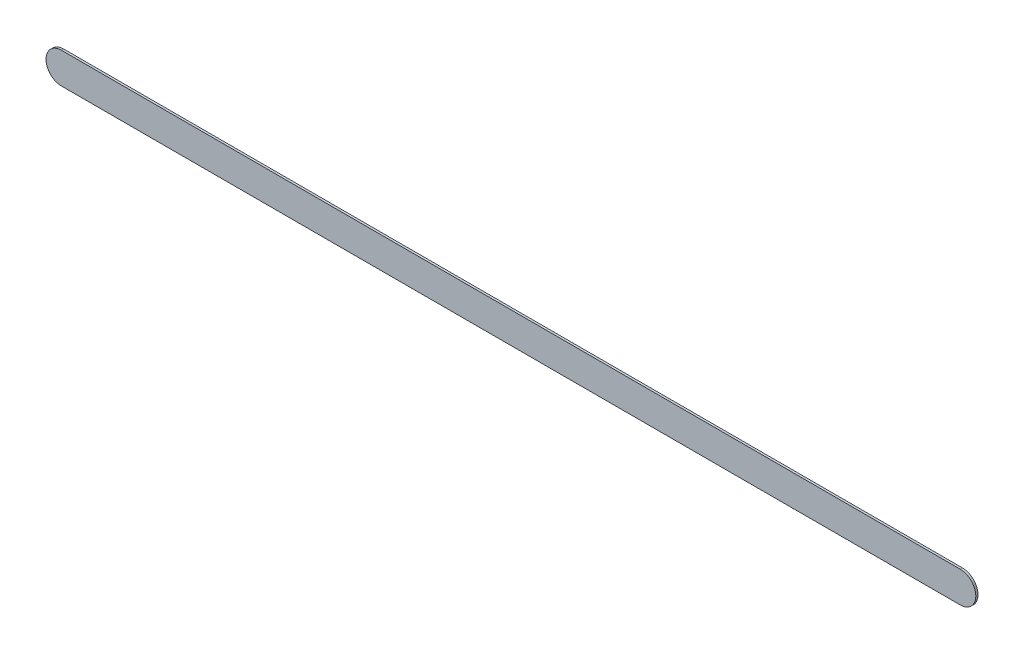
ISO-10303-21;
HEADER;
FILE_DESCRIPTION(('STEP AP214'),'2;1');
FILE_NAME('part.step','',(''),(''),'','','');
FILE_SCHEMA(('AUTOMOTIVE_DESIGN { 1 0 10303 214 1 1 1 1 }'));
ENDSEC;
DATA;
#1=APPLICATION_CONTEXT('core data for automotive mechanical design processes');
#2=APPLICATION_PROTOCOL_DEFINITION('international standard','automotive_design',2000,#1);
#3=PRODUCT_CONTEXT('',#1,'mechanical');
#4=PRODUCT('Part','Part','',(#3));
#5=PRODUCT_RELATED_PRODUCT_CATEGORY('part','',(#4));
#6=PRODUCT_DEFINITION_FORMATION('','',#4);
#7=PRODUCT_DEFINITION_CONTEXT('part definition',#1,'design');
#8=PRODUCT_DEFINITION('design','',#6,#7);
#9=PRODUCT_DEFINITION_SHAPE('','',#8);
#10=(LENGTH_UNIT() NAMED_UNIT(*) SI_UNIT(.MILLI.,.METRE.));
#11=(NAMED_UNIT(*) PLANE_ANGLE_UNIT() SI_UNIT($,.RADIAN.));
#12=(NAMED_UNIT(*) SI_UNIT($,.STERADIAN.) SOLID_ANGLE_UNIT());
#13=UNCERTAINTY_MEASURE_WITH_UNIT(LENGTH_MEASURE(1.E-05),#10,'distance_accuracy_value','');
#14=(GEOMETRIC_REPRESENTATION_CONTEXT(3) GLOBAL_UNCERTAINTY_ASSIGNED_CONTEXT((#13)) GLOBAL_UNIT_ASSIGNED_CONTEXT((#10,
#11,#12)) REPRESENTATION_CONTEXT('',''));
#15=CARTESIAN_POINT('',(0.,0.,0.));
#16=DIRECTION('',(0.,0.,1.));
#17=DIRECTION('',(1.,0.,0.));
#18=AXIS2_PLACEMENT_3D('',#15,#16,#17);
#19=CARTESIAN_POINT('',(37.4000014,80.24999952,0.));
#20=DIRECTION('',(0.,1.,0.));
#21=DIRECTION('',(1.,0.,0.));
#22=AXIS2_PLACEMENT_3D('',#19,#20,#21);
#23=PLANE('',#22);
#24=DIRECTION('',(1.,0.,0.));
#25=VECTOR('',#24,1.);
#26=CARTESIAN_POINT('',(37.4000014,80.24999952,0.03556));
#27=LINE('',#26,#25);
#28=CARTESIAN_POINT('',(37.4000014,80.24999952,0.03556));
#29=VERTEX_POINT('',#28);
#30=CARTESIAN_POINT('',(51.90000034,80.24999952,0.03556));
#31=VERTEX_POINT('',#30);
#32=EDGE_CURVE('E11',#29,#31,#27,.T.);
#33=ORIENTED_EDGE('',*,*,#32,.F.);
#34=DIRECTION('',(0.,0.,1.));
#35=VECTOR('',#34,1.);
#36=CARTESIAN_POINT('',(37.4000014,80.24999952,0.));
#37=LINE('',#36,#35);
#38=CARTESIAN_POINT('',(37.4000014,80.24999952,0.));
#39=VERTEX_POINT('',#38);
#40=EDGE_CURVE('E24',#39,#29,#37,.T.);
#41=ORIENTED_EDGE('',*,*,#40,.F.);
#42=DIRECTION('',(1.,0.,0.));
#43=VECTOR('',#42,1.);
#44=CARTESIAN_POINT('',(37.4000014,80.24999952,0.));
#45=LINE('',#44,#43);
#46=CARTESIAN_POINT('',(51.90000034,80.24999952,0.));
#47=VERTEX_POINT('',#46);
#48=EDGE_CURVE('E75',#39,#47,#45,.T.);
#49=ORIENTED_EDGE('',*,*,#48,.T.);
#50=DIRECTION('',(0.,0.,1.));
#51=VECTOR('',#50,1.);
#52=CARTESIAN_POINT('',(51.90000034,80.24999952,0.));
#53=LINE('',#52,#51);
#54=EDGE_CURVE('E37',#47,#31,#53,.T.);
#55=ORIENTED_EDGE('',*,*,#54,.T.);
#56=EDGE_LOOP('',(#33,#41,#49,#55));
#57=FACE_BOUND('',#56,.T.);
#58=ADVANCED_FACE('F17',(#57),#23,.F.);
#59=CARTESIAN_POINT('',(51.90000034,80.49999902,0.));
#60=DIRECTION('',(0.,0.,-1.));
#61=DIRECTION('',(0.,-1.,0.));
#62=AXIS2_PLACEMENT_3D('',#59,#60,#61);
#63=CYLINDRICAL_SURFACE('',#62,0.249999500000001);
#64=CARTESIAN_POINT('',(51.90000034,80.49999902,0.03556));
#65=DIRECTION('',(0.,0.,1.));
#66=DIRECTION('',(0.,-1.,0.));
#67=AXIS2_PLACEMENT_3D('',#64,#65,#66);
#68=CIRCLE('',#67,0.249999500000001);
#69=CARTESIAN_POINT('',(51.90000034,80.74999852,0.03556));
#70=VERTEX_POINT('',#69);
#71=EDGE_CURVE('E83',#31,#70,#68,.T.);
#72=ORIENTED_EDGE('',*,*,#71,.F.);
#73=ORIENTED_EDGE('',*,*,#54,.F.);
#74=CARTESIAN_POINT('',(51.90000034,80.49999902,0.));
#75=DIRECTION('',(0.,0.,1.));
#76=DIRECTION('',(0.,-1.,0.));
#77=AXIS2_PLACEMENT_3D('',#74,#75,#76);
#78=CIRCLE('',#77,0.249999500000001);
#79=CARTESIAN_POINT('',(51.90000034,80.74999852,0.));
#80=VERTEX_POINT('',#79);
#81=EDGE_CURVE('E81',#47,#80,#78,.T.);
#82=ORIENTED_EDGE('',*,*,#81,.T.);
#83=DIRECTION('',(0.,0.,1.));
#84=VECTOR('',#83,1.);
#85=CARTESIAN_POINT('',(51.90000034,80.74999852,0.));
#86=LINE('',#85,#84);
#87=EDGE_CURVE('E67',#80,#70,#86,.T.);
#88=ORIENTED_EDGE('',*,*,#87,.T.);
#89=EDGE_LOOP('',(#72,#73,#82,#88));
#90=FACE_BOUND('',#89,.T.);
#91=ADVANCED_FACE('F89',(#90),#63,.T.);
#92=CARTESIAN_POINT('',(51.90000034,80.74999852,0.));
#93=DIRECTION('',(0.,-1.,0.));
#94=DIRECTION('',(-1.,0.,0.));
#95=AXIS2_PLACEMENT_3D('',#92,#93,#94);
#96=PLANE('',#95);
#97=DIRECTION('',(-1.,0.,0.));
#98=VECTOR('',#97,1.);
#99=CARTESIAN_POINT('',(51.90000034,80.74999852,0.03556));
#100=LINE('',#99,#98);
#101=CARTESIAN_POINT('',(37.4000014,80.74999852,0.03556));
#102=VERTEX_POINT('',#101);
#103=EDGE_CURVE('E71',#70,#102,#100,.T.);
#104=ORIENTED_EDGE('',*,*,#103,.F.);
#105=ORIENTED_EDGE('',*,*,#87,.F.);
#106=DIRECTION('',(-1.,0.,0.));
#107=VECTOR('',#106,1.);
#108=CARTESIAN_POINT('',(51.90000034,80.74999852,0.));
#109=LINE('',#108,#107);
#110=CARTESIAN_POINT('',(37.4000014,80.74999852,0.));
#111=VERTEX_POINT('',#110);
#112=EDGE_CURVE('E63',#80,#111,#109,.T.);
#113=ORIENTED_EDGE('',*,*,#112,.T.);
#114=DIRECTION('',(0.,0.,1.));
#115=VECTOR('',#114,1.);
#116=CARTESIAN_POINT('',(37.4000014,80.74999852,0.));
#117=LINE('',#116,#115);
#118=EDGE_CURVE('E53',#111,#102,#117,.T.);
#119=ORIENTED_EDGE('',*,*,#118,.T.);
#120=EDGE_LOOP('',(#104,#105,#113,#119));
#121=FACE_BOUND('',#120,.T.);
#122=ADVANCED_FACE('F66',(#121),#96,.F.);
#123=CARTESIAN_POINT('',(37.4000014,80.49999902,0.));
#124=DIRECTION('',(0.,0.,-1.));
#125=DIRECTION('',(0.,1.,0.));
#126=AXIS2_PLACEMENT_3D('',#123,#124,#125);
#127=CYLINDRICAL_SURFACE('',#126,0.249999499999999);
#128=CARTESIAN_POINT('',(37.4000014,80.49999902,0.03556));
#129=DIRECTION('',(0.,0.,1.));
#130=DIRECTION('',(0.,1.,0.));
#131=AXIS2_PLACEMENT_3D('',#128,#129,#130);
#132=CIRCLE('',#131,0.249999499999999);
#133=EDGE_CURVE('E59',#102,#29,#132,.T.);
#134=ORIENTED_EDGE('',*,*,#133,.F.);
#135=ORIENTED_EDGE('',*,*,#118,.F.);
#136=CARTESIAN_POINT('',(37.4000014,80.49999902,0.));
#137=DIRECTION('',(0.,0.,1.));
#138=DIRECTION('',(0.,1.,0.));
#139=AXIS2_PLACEMENT_3D('',#136,#137,#138);
#140=CIRCLE('',#139,0.249999499999999);
#141=EDGE_CURVE('E57',#111,#39,#140,.T.);
#142=ORIENTED_EDGE('',*,*,#141,.T.);
#143=ORIENTED_EDGE('',*,*,#40,.T.);
#144=EDGE_LOOP('',(#134,#135,#142,#143));
#145=FACE_BOUND('',#144,.T.);
#146=ADVANCED_FACE('F55',(#145),#127,.T.);
#147=CARTESIAN_POINT('',(37.4000014,80.24999952,0.));
#148=DIRECTION('',(0.,0.,-1.));
#149=DIRECTION('',(-1.,0.,0.));
#150=AXIS2_PLACEMENT_3D('',#147,#148,#149);
#151=PLANE('',#150);
#152=ORIENTED_EDGE('',*,*,#141,.F.);
#153=ORIENTED_EDGE('',*,*,#112,.F.);
#154=ORIENTED_EDGE('',*,*,#81,.F.);
#155=ORIENTED_EDGE('',*,*,#48,.F.);
#156=EDGE_LOOP('',(#152,#153,#154,#155));
#157=FACE_BOUND('',#156,.T.);
#158=ADVANCED_FACE('F74',(#157),#151,.T.);
#159=CARTESIAN_POINT('',(37.4000014,80.24999952,0.03556));
#160=DIRECTION('',(0.,0.,-1.));
#161=DIRECTION('',(-1.,0.,0.));
#162=AXIS2_PLACEMENT_3D('',#159,#160,#161);
#163=PLANE('',#162);
#164=ORIENTED_EDGE('',*,*,#32,.T.);
#165=ORIENTED_EDGE('',*,*,#71,.T.);
#166=ORIENTED_EDGE('',*,*,#103,.T.);
#167=ORIENTED_EDGE('',*,*,#133,.T.);
#168=EDGE_LOOP('',(#164,#165,#166,#167));
#169=FACE_BOUND('',#168,.T.);
#170=ADVANCED_FACE('F91',(#169),#163,.F.);
#171=CLOSED_SHELL('',(#58,#91,#122,#146,#158,#170));
#172=MANIFOLD_SOLID_BREP('B1',#171);
#173=ADVANCED_BREP_SHAPE_REPRESENTATION('',(#18,#172),#14);
#174=SHAPE_DEFINITION_REPRESENTATION(#9,#173);
ENDSEC;
END-ISO-10303-21;
